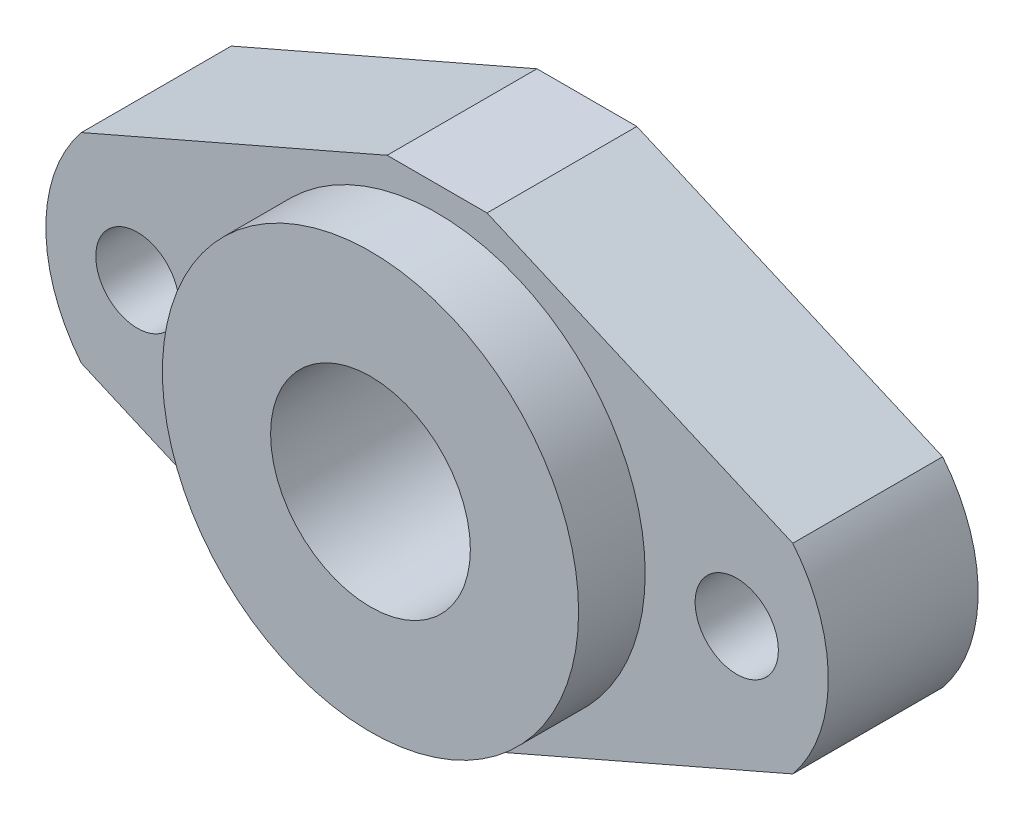
ISO-10303-21;
HEADER;
FILE_DESCRIPTION(('STEP AP214'),'2;1');
FILE_NAME('part.step','',(''),(''),'','','');
FILE_SCHEMA(('AUTOMOTIVE_DESIGN { 1 0 10303 214 1 1 1 1 }'));
ENDSEC;
DATA;
#1=APPLICATION_CONTEXT('core data for automotive mechanical design processes');
#2=APPLICATION_PROTOCOL_DEFINITION('international standard','automotive_design',2000,#1);
#3=PRODUCT_CONTEXT('',#1,'mechanical');
#4=PRODUCT('Part','Part','',(#3));
#5=PRODUCT_RELATED_PRODUCT_CATEGORY('part','',(#4));
#6=PRODUCT_DEFINITION_FORMATION('','',#4);
#7=PRODUCT_DEFINITION_CONTEXT('part definition',#1,'design');
#8=PRODUCT_DEFINITION('design','',#6,#7);
#9=PRODUCT_DEFINITION_SHAPE('','',#8);
#10=(LENGTH_UNIT() NAMED_UNIT(*) SI_UNIT(.MILLI.,.METRE.));
#11=(NAMED_UNIT(*) PLANE_ANGLE_UNIT() SI_UNIT($,.RADIAN.));
#12=(NAMED_UNIT(*) SI_UNIT($,.STERADIAN.) SOLID_ANGLE_UNIT());
#13=UNCERTAINTY_MEASURE_WITH_UNIT(LENGTH_MEASURE(1.E-05),#10,'distance_accuracy_value','');
#14=(GEOMETRIC_REPRESENTATION_CONTEXT(3) GLOBAL_UNCERTAINTY_ASSIGNED_CONTEXT((#13)) GLOBAL_UNIT_ASSIGNED_CONTEXT((#10,
#11,#12)) REPRESENTATION_CONTEXT('',''));
#15=CARTESIAN_POINT('',(0.,0.,0.));
#16=DIRECTION('',(0.,0.,1.));
#17=DIRECTION('',(1.,0.,0.));
#18=AXIS2_PLACEMENT_3D('',#15,#16,#17);
#19=CARTESIAN_POINT('',(0.,0.,9.));
#20=DIRECTION('',(0.,0.,1.));
#21=DIRECTION('',(1.,0.,0.));
#22=AXIS2_PLACEMENT_3D('',#19,#20,#21);
#23=PLANE('',#22);
#24=DIRECTION('',(-0.916795717889713,-0.399356496953644,0.));
#25=VECTOR('',#24,1.);
#26=CARTESIAN_POINT('',(5.60425340343677,-12.8655864157284,9.));
#27=LINE('',#26,#25);
#28=CARTESIAN_POINT('',(21.3654599313281,-6.,9.));
#29=VERTEX_POINT('',#28);
#30=CARTESIAN_POINT('',(3.,-14.,9.));
#31=VERTEX_POINT('',#30);
#32=EDGE_CURVE('E229',#29,#31,#27,.T.);
#33=ORIENTED_EDGE('',*,*,#32,.F.);
#34=CARTESIAN_POINT('',(14.,0.,9.));
#35=DIRECTION('',(0.,0.,1.));
#36=DIRECTION('',(1.,0.,0.));
#37=AXIS2_PLACEMENT_3D('',#34,#35,#36);
#38=CIRCLE('',#37,9.50000000000001);
#39=CARTESIAN_POINT('',(21.3654599313281,6.,9.));
#40=VERTEX_POINT('',#39);
#41=EDGE_CURVE('E231',#29,#40,#38,.T.);
#42=ORIENTED_EDGE('',*,*,#41,.T.);
#43=DIRECTION('',(-0.916795717889713,0.399356496953644,0.));
#44=VECTOR('',#43,1.);
#45=CARTESIAN_POINT('',(5.60425340343677,12.8655864157284,9.));
#46=LINE('',#45,#44);
#47=CARTESIAN_POINT('',(3.,14.,9.));
#48=VERTEX_POINT('',#47);
#49=EDGE_CURVE('E174',#40,#48,#46,.T.);
#50=ORIENTED_EDGE('',*,*,#49,.T.);
#51=DIRECTION('',(1.,0.,0.));
#52=VECTOR('',#51,1.);
#53=CARTESIAN_POINT('',(0.,14.,9.));
#54=LINE('',#53,#52);
#55=CARTESIAN_POINT('',(-3.,14.,9.));
#56=VERTEX_POINT('',#55);
#57=EDGE_CURVE('E129',#56,#48,#54,.T.);
#58=ORIENTED_EDGE('',*,*,#57,.F.);
#59=DIRECTION('',(0.916795717889713,0.399356496953644,0.));
#60=VECTOR('',#59,1.);
#61=CARTESIAN_POINT('',(-5.60425340343677,12.8655864157284,9.));
#62=LINE('',#61,#60);
#63=CARTESIAN_POINT('',(-21.3654599313281,6.,9.));
#64=VERTEX_POINT('',#63);
#65=EDGE_CURVE('E127',#64,#56,#62,.T.);
#66=ORIENTED_EDGE('',*,*,#65,.F.);
#67=CARTESIAN_POINT('',(-14.,0.,9.));
#68=DIRECTION('',(0.,0.,1.));
#69=DIRECTION('',(1.,0.,0.));
#70=AXIS2_PLACEMENT_3D('',#67,#68,#69);
#71=CIRCLE('',#70,9.50000000000001);
#72=CARTESIAN_POINT('',(-21.3654599313281,-6.,9.));
#73=VERTEX_POINT('',#72);
#74=EDGE_CURVE('E111',#73,#64,#71,.F.);
#75=ORIENTED_EDGE('',*,*,#74,.F.);
#76=DIRECTION('',(0.916795717889713,-0.399356496953644,0.));
#77=VECTOR('',#76,1.);
#78=CARTESIAN_POINT('',(-5.60425340343677,-12.8655864157284,9.));
#79=LINE('',#78,#77);
#80=CARTESIAN_POINT('',(-3.,-14.,9.));
#81=VERTEX_POINT('',#80);
#82=EDGE_CURVE('E120',#73,#81,#79,.T.);
#83=ORIENTED_EDGE('',*,*,#82,.T.);
#84=DIRECTION('',(1.,0.,0.));
#85=VECTOR('',#84,1.);
#86=CARTESIAN_POINT('',(0.,-14.,9.));
#87=LINE('',#86,#85);
#88=EDGE_CURVE('E52',#81,#31,#87,.T.);
#89=ORIENTED_EDGE('',*,*,#88,.T.);
#90=EDGE_LOOP('',(#33,#42,#50,#58,#66,#75,#83,#89));
#91=FACE_BOUND('',#90,.T.);
#92=CARTESIAN_POINT('',(18.,0.,9.));
#93=DIRECTION('',(0.,0.,1.));
#94=DIRECTION('',(1.,0.,0.));
#95=AXIS2_PLACEMENT_3D('',#92,#93,#94);
#96=CIRCLE('',#95,2.5);
#97=CARTESIAN_POINT('',(20.5,0.,9.));
#98=VERTEX_POINT('',#97);
#99=EDGE_CURVE('E205',#98,#98,#96,.T.);
#100=ORIENTED_EDGE('',*,*,#99,.F.);
#101=EDGE_LOOP('',(#100));
#102=FACE_BOUND('',#101,.T.);
#103=CARTESIAN_POINT('',(-18.,0.,9.));
#104=DIRECTION('',(0.,0.,1.));
#105=DIRECTION('',(1.,0.,0.));
#106=AXIS2_PLACEMENT_3D('',#103,#104,#105);
#107=CIRCLE('',#106,2.5);
#108=CARTESIAN_POINT('',(-15.5,0.,9.));
#109=VERTEX_POINT('',#108);
#110=EDGE_CURVE('E162',#109,#109,#107,.T.);
#111=ORIENTED_EDGE('',*,*,#110,.F.);
#112=EDGE_LOOP('',(#111));
#113=FACE_BOUND('',#112,.T.);
#114=CARTESIAN_POINT('',(0.,0.,9.));
#115=DIRECTION('',(0.,0.,1.));
#116=DIRECTION('',(1.,0.,0.));
#117=AXIS2_PLACEMENT_3D('',#114,#115,#116);
#118=CIRCLE('',#117,12.5);
#119=CARTESIAN_POINT('',(12.5,0.,9.));
#120=VERTEX_POINT('',#119);
#121=EDGE_CURVE('E219',#120,#120,#118,.T.);
#122=ORIENTED_EDGE('',*,*,#121,.F.);
#123=EDGE_LOOP('',(#122));
#124=FACE_BOUND('',#123,.T.);
#125=ADVANCED_FACE('F35',(#91,#102,#113,#124),#23,.T.);
#126=CARTESIAN_POINT('',(5.60425340343677,-12.8655864157284,9.));
#127=DIRECTION('',(0.399356496953644,-0.916795717889713,0.));
#128=DIRECTION('',(0.916795717889713,0.399356496953644,0.));
#129=AXIS2_PLACEMENT_3D('',#126,#127,#128);
#130=PLANE('',#129);
#131=DIRECTION('',(-0.916795717889713,-0.399356496953644,0.));
#132=VECTOR('',#131,1.);
#133=CARTESIAN_POINT('',(5.60425340343677,-12.8655864157284,0.));
#134=LINE('',#133,#132);
#135=CARTESIAN_POINT('',(21.3654599313281,-6.,0.));
#136=VERTEX_POINT('',#135);
#137=CARTESIAN_POINT('',(3.,-14.,0.));
#138=VERTEX_POINT('',#137);
#139=EDGE_CURVE('E144',#136,#138,#134,.T.);
#140=ORIENTED_EDGE('',*,*,#139,.F.);
#141=DIRECTION('',(0.,0.,-1.));
#142=VECTOR('',#141,1.);
#143=CARTESIAN_POINT('',(21.3654599313281,-6.,9.));
#144=LINE('',#143,#142);
#145=EDGE_CURVE('E11',#29,#136,#144,.T.);
#146=ORIENTED_EDGE('',*,*,#145,.F.);
#147=ORIENTED_EDGE('',*,*,#32,.T.);
#148=DIRECTION('',(0.,0.,-1.));
#149=VECTOR('',#148,1.);
#150=CARTESIAN_POINT('',(3.,-14.,9.));
#151=LINE('',#150,#149);
#152=EDGE_CURVE('E87',#31,#138,#151,.T.);
#153=ORIENTED_EDGE('',*,*,#152,.T.);
#154=EDGE_LOOP('',(#140,#146,#147,#153));
#155=FACE_BOUND('',#154,.T.);
#156=ADVANCED_FACE('F180',(#155),#130,.T.);
#157=CARTESIAN_POINT('',(14.,0.,9.));
#158=DIRECTION('',(0.,0.,-1.));
#159=DIRECTION('',(-1.,0.,0.));
#160=AXIS2_PLACEMENT_3D('',#157,#158,#159);
#161=CYLINDRICAL_SURFACE('',#160,9.50000000000001);
#162=CARTESIAN_POINT('',(14.,0.,0.));
#163=DIRECTION('',(0.,0.,1.));
#164=DIRECTION('',(1.,0.,0.));
#165=AXIS2_PLACEMENT_3D('',#162,#163,#164);
#166=CIRCLE('',#165,9.50000000000001);
#167=CARTESIAN_POINT('',(21.3654599313281,6.,0.));
#168=VERTEX_POINT('',#167);
#169=EDGE_CURVE('E146',#136,#168,#166,.T.);
#170=ORIENTED_EDGE('',*,*,#169,.T.);
#171=DIRECTION('',(0.,0.,-1.));
#172=VECTOR('',#171,1.);
#173=CARTESIAN_POINT('',(21.3654599313281,6.,9.));
#174=LINE('',#173,#172);
#175=EDGE_CURVE('E44',#40,#168,#174,.T.);
#176=ORIENTED_EDGE('',*,*,#175,.F.);
#177=ORIENTED_EDGE('',*,*,#41,.F.);
#178=ORIENTED_EDGE('',*,*,#145,.T.);
#179=EDGE_LOOP('',(#170,#176,#177,#178));
#180=FACE_BOUND('',#179,.T.);
#181=ADVANCED_FACE('F178',(#180),#161,.T.);
#182=CARTESIAN_POINT('',(5.60425340343677,12.8655864157284,9.));
#183=DIRECTION('',(-0.399356496953644,-0.916795717889713,0.));
#184=DIRECTION('',(0.916795717889713,-0.399356496953644,0.));
#185=AXIS2_PLACEMENT_3D('',#182,#183,#184);
#186=PLANE('',#185);
#187=DIRECTION('',(-0.916795717889713,0.399356496953644,0.));
#188=VECTOR('',#187,1.);
#189=CARTESIAN_POINT('',(5.60425340343677,12.8655864157284,0.));
#190=LINE('',#189,#188);
#191=CARTESIAN_POINT('',(3.,14.,0.));
#192=VERTEX_POINT('',#191);
#193=EDGE_CURVE('E149',#168,#192,#190,.T.);
#194=ORIENTED_EDGE('',*,*,#193,.T.);
#195=DIRECTION('',(0.,0.,-1.));
#196=VECTOR('',#195,1.);
#197=CARTESIAN_POINT('',(3.,14.,9.));
#198=LINE('',#197,#196);
#199=EDGE_CURVE('E168',#48,#192,#198,.T.);
#200=ORIENTED_EDGE('',*,*,#199,.F.);
#201=ORIENTED_EDGE('',*,*,#49,.F.);
#202=ORIENTED_EDGE('',*,*,#175,.T.);
#203=EDGE_LOOP('',(#194,#200,#201,#202));
#204=FACE_BOUND('',#203,.T.);
#205=ADVANCED_FACE('F172',(#204),#186,.F.);
#206=CARTESIAN_POINT('',(0.,14.,9.));
#207=DIRECTION('',(0.,1.,0.));
#208=DIRECTION('',(0.,0.,1.));
#209=AXIS2_PLACEMENT_3D('',#206,#207,#208);
#210=PLANE('',#209);
#211=DIRECTION('',(1.,0.,0.));
#212=VECTOR('',#211,1.);
#213=CARTESIAN_POINT('',(0.,14.,0.));
#214=LINE('',#213,#212);
#215=CARTESIAN_POINT('',(-3.,14.,0.));
#216=VERTEX_POINT('',#215);
#217=EDGE_CURVE('E152',#216,#192,#214,.T.);
#218=ORIENTED_EDGE('',*,*,#217,.F.);
#219=DIRECTION('',(0.,0.,-1.));
#220=VECTOR('',#219,1.);
#221=CARTESIAN_POINT('',(-3.,14.,9.));
#222=LINE('',#221,#220);
#223=EDGE_CURVE('E166',#56,#216,#222,.T.);
#224=ORIENTED_EDGE('',*,*,#223,.F.);
#225=ORIENTED_EDGE('',*,*,#57,.T.);
#226=ORIENTED_EDGE('',*,*,#199,.T.);
#227=EDGE_LOOP('',(#218,#224,#225,#226));
#228=FACE_BOUND('',#227,.T.);
#229=ADVANCED_FACE('F236',(#228),#210,.T.);
#230=CARTESIAN_POINT('',(-5.60425340343677,12.8655864157284,9.));
#231=DIRECTION('',(-0.399356496953644,0.916795717889713,0.));
#232=DIRECTION('',(-0.916795717889713,-0.399356496953644,0.));
#233=AXIS2_PLACEMENT_3D('',#230,#231,#232);
#234=PLANE('',#233);
#235=DIRECTION('',(0.916795717889713,0.399356496953644,0.));
#236=VECTOR('',#235,1.);
#237=CARTESIAN_POINT('',(-5.60425340343677,12.8655864157284,0.));
#238=LINE('',#237,#236);
#239=CARTESIAN_POINT('',(-21.3654599313281,6.,0.));
#240=VERTEX_POINT('',#239);
#241=EDGE_CURVE('E155',#240,#216,#238,.T.);
#242=ORIENTED_EDGE('',*,*,#241,.F.);
#243=DIRECTION('',(0.,0.,-1.));
#244=VECTOR('',#243,1.);
#245=CARTESIAN_POINT('',(-21.3654599313281,6.,9.));
#246=LINE('',#245,#244);
#247=EDGE_CURVE('E116',#64,#240,#246,.T.);
#248=ORIENTED_EDGE('',*,*,#247,.F.);
#249=ORIENTED_EDGE('',*,*,#65,.T.);
#250=ORIENTED_EDGE('',*,*,#223,.T.);
#251=EDGE_LOOP('',(#242,#248,#249,#250));
#252=FACE_BOUND('',#251,.T.);
#253=ADVANCED_FACE('F239',(#252),#234,.T.);
#254=CARTESIAN_POINT('',(-14.,0.,9.));
#255=DIRECTION('',(0.,0.,-1.));
#256=DIRECTION('',(-1.,0.,0.));
#257=AXIS2_PLACEMENT_3D('',#254,#255,#256);
#258=CYLINDRICAL_SURFACE('',#257,9.50000000000001);
#259=CARTESIAN_POINT('',(-14.,0.,0.));
#260=DIRECTION('',(0.,0.,1.));
#261=DIRECTION('',(1.,0.,0.));
#262=AXIS2_PLACEMENT_3D('',#259,#260,#261);
#263=CIRCLE('',#262,9.50000000000001);
#264=CARTESIAN_POINT('',(-21.3654599313281,-6.,0.));
#265=VERTEX_POINT('',#264);
#266=EDGE_CURVE('E113',#265,#240,#263,.F.);
#267=ORIENTED_EDGE('',*,*,#266,.F.);
#268=DIRECTION('',(0.,0.,-1.));
#269=VECTOR('',#268,1.);
#270=CARTESIAN_POINT('',(-21.3654599313281,-6.,9.));
#271=LINE('',#270,#269);
#272=EDGE_CURVE('E107',#73,#265,#271,.T.);
#273=ORIENTED_EDGE('',*,*,#272,.F.);
#274=ORIENTED_EDGE('',*,*,#74,.T.);
#275=ORIENTED_EDGE('',*,*,#247,.T.);
#276=EDGE_LOOP('',(#267,#273,#274,#275));
#277=FACE_BOUND('',#276,.T.);
#278=ADVANCED_FACE('F109',(#277),#258,.T.);
#279=CARTESIAN_POINT('',(-5.60425340343677,-12.8655864157284,9.));
#280=DIRECTION('',(0.399356496953644,0.916795717889713,0.));
#281=DIRECTION('',(-0.916795717889713,0.399356496953644,0.));
#282=AXIS2_PLACEMENT_3D('',#279,#280,#281);
#283=PLANE('',#282);
#284=DIRECTION('',(0.916795717889713,-0.399356496953644,0.));
#285=VECTOR('',#284,1.);
#286=CARTESIAN_POINT('',(-5.60425340343677,-12.8655864157284,0.));
#287=LINE('',#286,#285);
#288=CARTESIAN_POINT('',(-3.,-14.,0.));
#289=VERTEX_POINT('',#288);
#290=EDGE_CURVE('E159',#265,#289,#287,.T.);
#291=ORIENTED_EDGE('',*,*,#290,.T.);
#292=DIRECTION('',(0.,0.,-1.));
#293=VECTOR('',#292,1.);
#294=CARTESIAN_POINT('',(-3.,-14.,9.));
#295=LINE('',#294,#293);
#296=EDGE_CURVE('E117',#81,#289,#295,.T.);
#297=ORIENTED_EDGE('',*,*,#296,.F.);
#298=ORIENTED_EDGE('',*,*,#82,.F.);
#299=ORIENTED_EDGE('',*,*,#272,.T.);
#300=EDGE_LOOP('',(#291,#297,#298,#299));
#301=FACE_BOUND('',#300,.T.);
#302=ADVANCED_FACE('F121',(#301),#283,.F.);
#303=CARTESIAN_POINT('',(0.,0.,9.));
#304=DIRECTION('',(0.,0.,-1.));
#305=DIRECTION('',(-1.,0.,0.));
#306=AXIS2_PLACEMENT_3D('',#303,#304,#305);
#307=CYLINDRICAL_SURFACE('',#306,6.);
#308=CARTESIAN_POINT('',(0.,0.,0.));
#309=DIRECTION('',(0.,0.,1.));
#310=DIRECTION('',(1.,0.,0.));
#311=AXIS2_PLACEMENT_3D('',#308,#309,#310);
#312=CIRCLE('',#311,6.);
#313=CARTESIAN_POINT('',(6.,0.,0.));
#314=VERTEX_POINT('',#313);
#315=EDGE_CURVE('E141',#314,#314,#312,.T.);
#316=ORIENTED_EDGE('',*,*,#315,.F.);
#317=EDGE_LOOP('',(#316));
#318=FACE_BOUND('',#317,.T.);
#319=CARTESIAN_POINT('',(0.,0.,13.));
#320=DIRECTION('',(0.,0.,1.));
#321=DIRECTION('',(1.,0.,0.));
#322=AXIS2_PLACEMENT_3D('',#319,#320,#321);
#323=CIRCLE('',#322,6.);
#324=CARTESIAN_POINT('',(6.,0.,13.));
#325=VERTEX_POINT('',#324);
#326=EDGE_CURVE('E217',#325,#325,#323,.T.);
#327=ORIENTED_EDGE('',*,*,#326,.T.);
#328=EDGE_LOOP('',(#327));
#329=FACE_BOUND('',#328,.T.);
#330=ADVANCED_FACE('F191',(#318,#329),#307,.F.);
#331=CARTESIAN_POINT('',(18.,0.,9.));
#332=DIRECTION('',(0.,0.,-1.));
#333=DIRECTION('',(-1.,0.,0.));
#334=AXIS2_PLACEMENT_3D('',#331,#332,#333);
#335=CYLINDRICAL_SURFACE('',#334,2.5);
#336=ORIENTED_EDGE('',*,*,#99,.T.);
#337=EDGE_LOOP('',(#336));
#338=FACE_BOUND('',#337,.T.);
#339=CARTESIAN_POINT('',(18.,0.,0.));
#340=DIRECTION('',(0.,0.,1.));
#341=DIRECTION('',(1.,0.,0.));
#342=AXIS2_PLACEMENT_3D('',#339,#340,#341);
#343=CIRCLE('',#342,2.5);
#344=CARTESIAN_POINT('',(20.5,0.,0.));
#345=VERTEX_POINT('',#344);
#346=EDGE_CURVE('E137',#345,#345,#343,.T.);
#347=ORIENTED_EDGE('',*,*,#346,.F.);
#348=EDGE_LOOP('',(#347));
#349=FACE_BOUND('',#348,.T.);
#350=ADVANCED_FACE('F193',(#338,#349),#335,.F.);
#351=CARTESIAN_POINT('',(-18.,0.,9.));
#352=DIRECTION('',(0.,0.,-1.));
#353=DIRECTION('',(-1.,0.,0.));
#354=AXIS2_PLACEMENT_3D('',#351,#352,#353);
#355=CYLINDRICAL_SURFACE('',#354,2.5);
#356=ORIENTED_EDGE('',*,*,#110,.T.);
#357=EDGE_LOOP('',(#356));
#358=FACE_BOUND('',#357,.T.);
#359=CARTESIAN_POINT('',(-18.,0.,0.));
#360=DIRECTION('',(0.,0.,1.));
#361=DIRECTION('',(1.,0.,0.));
#362=AXIS2_PLACEMENT_3D('',#359,#360,#361);
#363=CIRCLE('',#362,2.5);
#364=CARTESIAN_POINT('',(-15.5,0.,0.));
#365=VERTEX_POINT('',#364);
#366=EDGE_CURVE('E134',#365,#365,#363,.T.);
#367=ORIENTED_EDGE('',*,*,#366,.F.);
#368=EDGE_LOOP('',(#367));
#369=FACE_BOUND('',#368,.T.);
#370=ADVANCED_FACE('F37',(#358,#369),#355,.F.);
#371=CARTESIAN_POINT('',(0.,-14.,9.));
#372=DIRECTION('',(0.,1.,0.));
#373=DIRECTION('',(0.,0.,1.));
#374=AXIS2_PLACEMENT_3D('',#371,#372,#373);
#375=PLANE('',#374);
#376=DIRECTION('',(1.,0.,0.));
#377=VECTOR('',#376,1.);
#378=CARTESIAN_POINT('',(0.,-14.,0.));
#379=LINE('',#378,#377);
#380=EDGE_CURVE('E80',#289,#138,#379,.T.);
#381=ORIENTED_EDGE('',*,*,#380,.T.);
#382=ORIENTED_EDGE('',*,*,#152,.F.);
#383=ORIENTED_EDGE('',*,*,#88,.F.);
#384=ORIENTED_EDGE('',*,*,#296,.T.);
#385=EDGE_LOOP('',(#381,#382,#383,#384));
#386=FACE_BOUND('',#385,.T.);
#387=ADVANCED_FACE('F200',(#386),#375,.F.);
#388=CARTESIAN_POINT('',(0.,0.,0.));
#389=DIRECTION('',(0.,0.,1.));
#390=DIRECTION('',(1.,0.,0.));
#391=AXIS2_PLACEMENT_3D('',#388,#389,#390);
#392=PLANE('',#391);
#393=ORIENTED_EDGE('',*,*,#366,.T.);
#394=EDGE_LOOP('',(#393));
#395=FACE_BOUND('',#394,.T.);
#396=ORIENTED_EDGE('',*,*,#346,.T.);
#397=EDGE_LOOP('',(#396));
#398=FACE_BOUND('',#397,.T.);
#399=ORIENTED_EDGE('',*,*,#315,.T.);
#400=EDGE_LOOP('',(#399));
#401=FACE_BOUND('',#400,.T.);
#402=ORIENTED_EDGE('',*,*,#139,.T.);
#403=ORIENTED_EDGE('',*,*,#380,.F.);
#404=ORIENTED_EDGE('',*,*,#290,.F.);
#405=ORIENTED_EDGE('',*,*,#266,.T.);
#406=ORIENTED_EDGE('',*,*,#241,.T.);
#407=ORIENTED_EDGE('',*,*,#217,.T.);
#408=ORIENTED_EDGE('',*,*,#193,.F.);
#409=ORIENTED_EDGE('',*,*,#169,.F.);
#410=EDGE_LOOP('',(#402,#403,#404,#405,#406,#407,#408,#409));
#411=FACE_BOUND('',#410,.T.);
#412=ADVANCED_FACE('F179',(#395,#398,#401,#411),#392,.F.);
#413=CARTESIAN_POINT('',(0.,0.,13.));
#414=DIRECTION('',(0.,0.,1.));
#415=DIRECTION('',(1.,0.,0.));
#416=AXIS2_PLACEMENT_3D('',#413,#414,#415);
#417=PLANE('',#416);
#418=CARTESIAN_POINT('',(0.,0.,13.));
#419=DIRECTION('',(0.,0.,1.));
#420=DIRECTION('',(1.,0.,0.));
#421=AXIS2_PLACEMENT_3D('',#418,#419,#420);
#422=CIRCLE('',#421,12.5);
#423=CARTESIAN_POINT('',(12.5,0.,13.));
#424=VERTEX_POINT('',#423);
#425=EDGE_CURVE('E138',#424,#424,#422,.T.);
#426=ORIENTED_EDGE('',*,*,#425,.T.);
#427=EDGE_LOOP('',(#426));
#428=FACE_BOUND('',#427,.T.);
#429=ORIENTED_EDGE('',*,*,#326,.F.);
#430=EDGE_LOOP('',(#429));
#431=FACE_BOUND('',#430,.T.);
#432=ADVANCED_FACE('F210',(#428,#431),#417,.T.);
#433=CARTESIAN_POINT('',(0.,0.,13.));
#434=DIRECTION('',(0.,0.,-1.));
#435=DIRECTION('',(-1.,0.,0.));
#436=AXIS2_PLACEMENT_3D('',#433,#434,#435);
#437=CYLINDRICAL_SURFACE('',#436,12.5);
#438=ORIENTED_EDGE('',*,*,#425,.F.);
#439=EDGE_LOOP('',(#438));
#440=FACE_BOUND('',#439,.T.);
#441=ORIENTED_EDGE('',*,*,#121,.T.);
#442=EDGE_LOOP('',(#441));
#443=FACE_BOUND('',#442,.T.);
#444=ADVANCED_FACE('F323',(#440,#443),#437,.T.);
#445=CLOSED_SHELL('',(#125,#156,#181,#205,#229,#253,#278,#302,#330,#350,#370,#387,#412,#432,#444));
#446=MANIFOLD_SOLID_BREP('B2',#445);
#447=ADVANCED_BREP_SHAPE_REPRESENTATION('',(#18,#446),#14);
#448=SHAPE_DEFINITION_REPRESENTATION(#9,#447);
ENDSEC;
END-ISO-10303-21;
